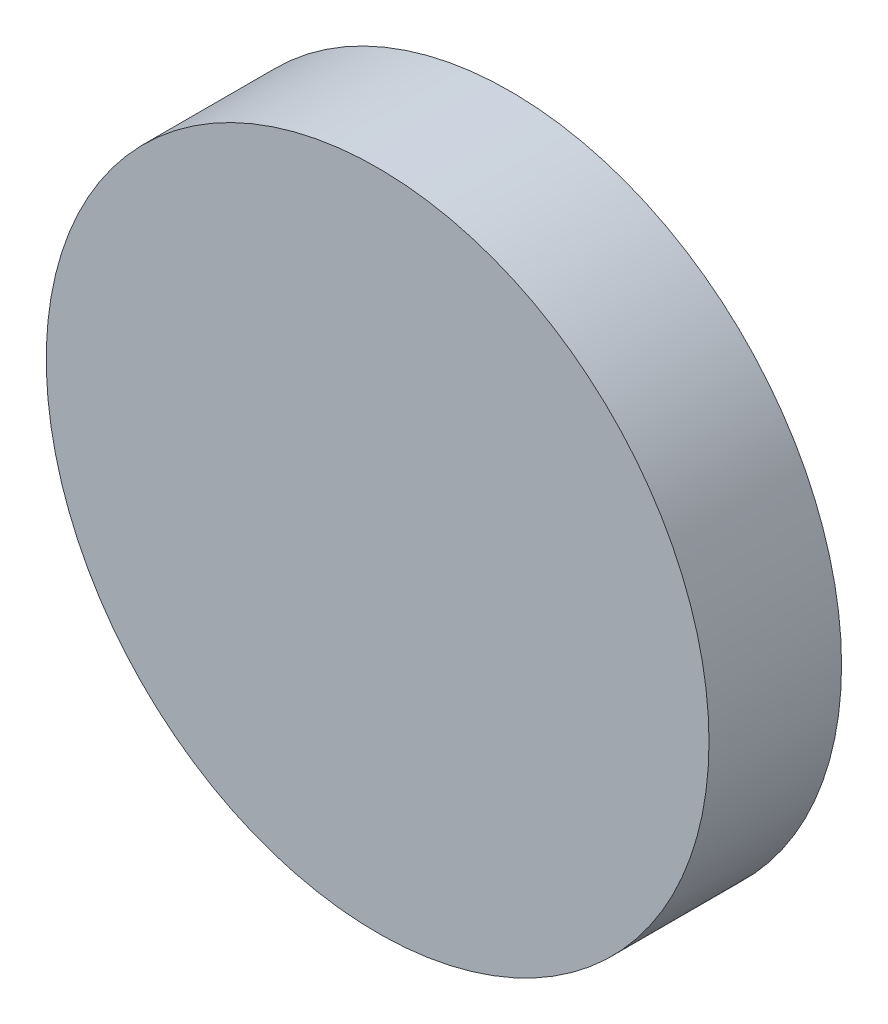
ISO-10303-21;
HEADER;
FILE_DESCRIPTION(('STEP AP214'),'2;1');
FILE_NAME('part.step','',(''),(''),'','','');
FILE_SCHEMA(('AUTOMOTIVE_DESIGN { 1 0 10303 214 1 1 1 1 }'));
ENDSEC;
DATA;
#1=APPLICATION_CONTEXT('core data for automotive mechanical design processes');
#2=APPLICATION_PROTOCOL_DEFINITION('international standard','automotive_design',2000,#1);
#3=PRODUCT_CONTEXT('',#1,'mechanical');
#4=PRODUCT('Part','Part','',(#3));
#5=PRODUCT_RELATED_PRODUCT_CATEGORY('part','',(#4));
#6=PRODUCT_DEFINITION_FORMATION('','',#4);
#7=PRODUCT_DEFINITION_CONTEXT('part definition',#1,'design');
#8=PRODUCT_DEFINITION('design','',#6,#7);
#9=PRODUCT_DEFINITION_SHAPE('','',#8);
#10=(LENGTH_UNIT() NAMED_UNIT(*) SI_UNIT(.MILLI.,.METRE.));
#11=(NAMED_UNIT(*) PLANE_ANGLE_UNIT() SI_UNIT($,.RADIAN.));
#12=(NAMED_UNIT(*) SI_UNIT($,.STERADIAN.) SOLID_ANGLE_UNIT());
#13=UNCERTAINTY_MEASURE_WITH_UNIT(LENGTH_MEASURE(1.E-05),#10,'distance_accuracy_value','');
#14=(GEOMETRIC_REPRESENTATION_CONTEXT(3) GLOBAL_UNCERTAINTY_ASSIGNED_CONTEXT((#13)) GLOBAL_UNIT_ASSIGNED_CONTEXT((#10,
#11,#12)) REPRESENTATION_CONTEXT('',''));
#15=CARTESIAN_POINT('',(0.,0.,0.));
#16=DIRECTION('',(0.,0.,1.));
#17=DIRECTION('',(1.,0.,0.));
#18=AXIS2_PLACEMENT_3D('',#15,#16,#17);
#19=CARTESIAN_POINT('',(450.,1805.,-240.));
#20=DIRECTION('',(0.,0.,1.));
#21=DIRECTION('',(1.,0.,0.));
#22=AXIS2_PLACEMENT_3D('',#19,#20,#21);
#23=CYLINDRICAL_SURFACE('',#22,100.);
#24=CARTESIAN_POINT('',(450.,1805.,-240.));
#25=DIRECTION('',(0.,0.,1.));
#26=DIRECTION('',(1.,0.,0.));
#27=AXIS2_PLACEMENT_3D('',#24,#25,#26);
#28=CIRCLE('',#27,100.);
#29=CARTESIAN_POINT('',(550.,1805.,-240.));
#30=VERTEX_POINT('',#29);
#31=EDGE_CURVE('E10',#30,#30,#28,.T.);
#32=ORIENTED_EDGE('',*,*,#31,.T.);
#33=EDGE_LOOP('',(#32));
#34=FACE_BOUND('',#33,.T.);
#35=CARTESIAN_POINT('',(450.,1805.,-200.));
#36=DIRECTION('',(0.,0.,1.));
#37=DIRECTION('',(1.,0.,0.));
#38=AXIS2_PLACEMENT_3D('',#35,#36,#37);
#39=CIRCLE('',#38,100.);
#40=CARTESIAN_POINT('',(550.,1805.,-200.));
#41=VERTEX_POINT('',#40);
#42=EDGE_CURVE('E40',#41,#41,#39,.T.);
#43=ORIENTED_EDGE('',*,*,#42,.F.);
#44=EDGE_LOOP('',(#43));
#45=FACE_BOUND('',#44,.T.);
#46=ADVANCED_FACE('F37',(#34,#45),#23,.T.);
#47=CARTESIAN_POINT('',(450.,1805.,-240.));
#48=DIRECTION('',(0.,0.,1.));
#49=DIRECTION('',(1.,0.,0.));
#50=AXIS2_PLACEMENT_3D('',#47,#48,#49);
#51=PLANE('',#50);
#52=ORIENTED_EDGE('',*,*,#31,.F.);
#53=EDGE_LOOP('',(#52));
#54=FACE_BOUND('',#53,.T.);
#55=ADVANCED_FACE('F52',(#54),#51,.F.);
#56=CARTESIAN_POINT('',(450.,1805.,-200.));
#57=DIRECTION('',(0.,0.,1.));
#58=DIRECTION('',(1.,0.,0.));
#59=AXIS2_PLACEMENT_3D('',#56,#57,#58);
#60=PLANE('',#59);
#61=ORIENTED_EDGE('',*,*,#42,.T.);
#62=EDGE_LOOP('',(#61));
#63=FACE_BOUND('',#62,.T.);
#64=ADVANCED_FACE('F49',(#63),#60,.T.);
#65=CLOSED_SHELL('',(#46,#55,#64));
#66=MANIFOLD_SOLID_BREP('B2',#65);
#67=ADVANCED_BREP_SHAPE_REPRESENTATION('',(#18,#66),#14);
#68=SHAPE_DEFINITION_REPRESENTATION(#9,#67);
ENDSEC;
END-ISO-10303-21;
